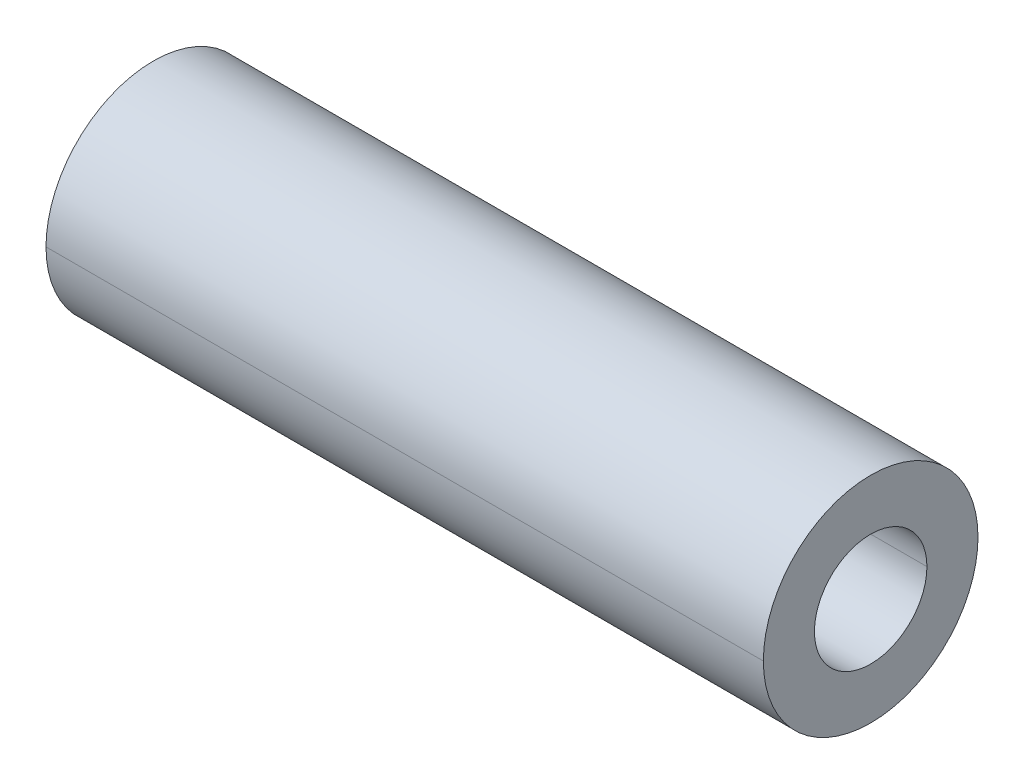
ISO-10303-21;
HEADER;
FILE_DESCRIPTION(('STEP AP214'),'2;1');
FILE_NAME('part.step','',(''),(''),'','','');
FILE_SCHEMA(('AUTOMOTIVE_DESIGN { 1 0 10303 214 1 1 1 1 }'));
ENDSEC;
DATA;
#1=APPLICATION_CONTEXT('core data for automotive mechanical design processes');
#2=APPLICATION_PROTOCOL_DEFINITION('international standard','automotive_design',2000,#1);
#3=PRODUCT_CONTEXT('',#1,'mechanical');
#4=PRODUCT('Part','Part','',(#3));
#5=PRODUCT_RELATED_PRODUCT_CATEGORY('part','',(#4));
#6=PRODUCT_DEFINITION_FORMATION('','',#4);
#7=PRODUCT_DEFINITION_CONTEXT('part definition',#1,'design');
#8=PRODUCT_DEFINITION('design','',#6,#7);
#9=PRODUCT_DEFINITION_SHAPE('','',#8);
#10=(LENGTH_UNIT() NAMED_UNIT(*) SI_UNIT(.MILLI.,.METRE.));
#11=(NAMED_UNIT(*) PLANE_ANGLE_UNIT() SI_UNIT($,.RADIAN.));
#12=(NAMED_UNIT(*) SI_UNIT($,.STERADIAN.) SOLID_ANGLE_UNIT());
#13=UNCERTAINTY_MEASURE_WITH_UNIT(LENGTH_MEASURE(1.E-05),#10,'distance_accuracy_value','');
#14=(GEOMETRIC_REPRESENTATION_CONTEXT(3) GLOBAL_UNCERTAINTY_ASSIGNED_CONTEXT((#13)) GLOBAL_UNIT_ASSIGNED_CONTEXT((#10,
#11,#12)) REPRESENTATION_CONTEXT('',''));
#15=CARTESIAN_POINT('',(0.,0.,0.));
#16=DIRECTION('',(0.,0.,1.));
#17=DIRECTION('',(1.,0.,0.));
#18=AXIS2_PLACEMENT_3D('',#15,#16,#17);
#19=CARTESIAN_POINT('',(15.875,0.,0.));
#20=DIRECTION('',(-1.,0.,0.));
#21=DIRECTION('',(0.,0.,1.));
#22=AXIS2_PLACEMENT_3D('',#19,#20,#21);
#23=CYLINDRICAL_SURFACE('',#22,2.4892);
#24=DIRECTION('',(-1.,0.,0.));
#25=VECTOR('',#24,1.);
#26=CARTESIAN_POINT('',(15.875,0.,-2.4892));
#27=LINE('',#26,#25);
#28=CARTESIAN_POINT('',(15.875,0.,-2.4892));
#29=VERTEX_POINT('',#28);
#30=CARTESIAN_POINT('',(-15.875,0.,-2.4892));
#31=VERTEX_POINT('',#30);
#32=EDGE_CURVE('E85',#29,#31,#27,.T.);
#33=ORIENTED_EDGE('',*,*,#32,.F.);
#34=CARTESIAN_POINT('',(15.875,0.,0.));
#35=DIRECTION('',(1.,0.,0.));
#36=DIRECTION('',(0.,0.,-1.));
#37=AXIS2_PLACEMENT_3D('',#34,#35,#36);
#38=CIRCLE('',#37,2.4892);
#39=CARTESIAN_POINT('',(15.875,0.,2.4892));
#40=VERTEX_POINT('',#39);
#41=EDGE_CURVE('E80',#29,#40,#38,.T.);
#42=ORIENTED_EDGE('',*,*,#41,.T.);
#43=DIRECTION('',(-1.,0.,0.));
#44=VECTOR('',#43,1.);
#45=CARTESIAN_POINT('',(15.875,0.,2.4892));
#46=LINE('',#45,#44);
#47=CARTESIAN_POINT('',(-15.875,0.,2.4892));
#48=VERTEX_POINT('',#47);
#49=EDGE_CURVE('E82',#40,#48,#46,.T.);
#50=ORIENTED_EDGE('',*,*,#49,.T.);
#51=CARTESIAN_POINT('',(-15.875,0.,0.));
#52=DIRECTION('',(1.,0.,0.));
#53=DIRECTION('',(0.,0.,-1.));
#54=AXIS2_PLACEMENT_3D('',#51,#52,#53);
#55=CIRCLE('',#54,2.4892);
#56=EDGE_CURVE('E11',#31,#48,#55,.T.);
#57=ORIENTED_EDGE('',*,*,#56,.F.);
#58=EDGE_LOOP('',(#33,#42,#50,#57));
#59=FACE_BOUND('',#58,.T.);
#60=ADVANCED_FACE('F16',(#59),#23,.F.);
#61=CARTESIAN_POINT('',(15.875,0.,0.));
#62=DIRECTION('',(-1.,0.,0.));
#63=DIRECTION('',(0.,0.,1.));
#64=AXIS2_PLACEMENT_3D('',#61,#62,#63);
#65=CYLINDRICAL_SURFACE('',#64,4.7498);
#66=DIRECTION('',(-1.,0.,0.));
#67=VECTOR('',#66,1.);
#68=CARTESIAN_POINT('',(15.875,0.,-4.7498));
#69=LINE('',#68,#67);
#70=CARTESIAN_POINT('',(15.875,0.,-4.7498));
#71=VERTEX_POINT('',#70);
#72=CARTESIAN_POINT('',(-15.875,0.,-4.7498));
#73=VERTEX_POINT('',#72);
#74=EDGE_CURVE('E112',#71,#73,#69,.T.);
#75=ORIENTED_EDGE('',*,*,#74,.F.);
#76=CARTESIAN_POINT('',(15.875,0.,0.));
#77=DIRECTION('',(1.,0.,0.));
#78=DIRECTION('',(0.,0.,-1.));
#79=AXIS2_PLACEMENT_3D('',#76,#77,#78);
#80=CIRCLE('',#79,4.7498);
#81=CARTESIAN_POINT('',(15.875,0.,4.7498));
#82=VERTEX_POINT('',#81);
#83=EDGE_CURVE('E53',#82,#71,#80,.T.);
#84=ORIENTED_EDGE('',*,*,#83,.F.);
#85=DIRECTION('',(-1.,0.,0.));
#86=VECTOR('',#85,1.);
#87=CARTESIAN_POINT('',(15.875,0.,4.7498));
#88=LINE('',#87,#86);
#89=CARTESIAN_POINT('',(-15.875,0.,4.7498));
#90=VERTEX_POINT('',#89);
#91=EDGE_CURVE('E109',#82,#90,#88,.T.);
#92=ORIENTED_EDGE('',*,*,#91,.T.);
#93=CARTESIAN_POINT('',(-15.875,0.,0.));
#94=DIRECTION('',(1.,0.,0.));
#95=DIRECTION('',(0.,0.,-1.));
#96=AXIS2_PLACEMENT_3D('',#93,#94,#95);
#97=CIRCLE('',#96,4.7498);
#98=EDGE_CURVE('E27',#90,#73,#97,.T.);
#99=ORIENTED_EDGE('',*,*,#98,.T.);
#100=EDGE_LOOP('',(#75,#84,#92,#99));
#101=FACE_BOUND('',#100,.T.);
#102=ADVANCED_FACE('F18',(#101),#65,.T.);
#103=CARTESIAN_POINT('',(-15.875,0.,0.));
#104=DIRECTION('',(1.,0.,0.));
#105=DIRECTION('',(0.,1.,0.));
#106=AXIS2_PLACEMENT_3D('',#103,#104,#105);
#107=PLANE('',#106);
#108=CARTESIAN_POINT('',(-15.875,0.,0.));
#109=DIRECTION('',(1.,0.,0.));
#110=DIRECTION('',(0.,0.,-1.));
#111=AXIS2_PLACEMENT_3D('',#108,#109,#110);
#112=CIRCLE('',#111,2.4892);
#113=EDGE_CURVE('E94',#48,#31,#112,.T.);
#114=ORIENTED_EDGE('',*,*,#113,.T.);
#115=ORIENTED_EDGE('',*,*,#56,.T.);
#116=EDGE_LOOP('',(#114,#115));
#117=FACE_BOUND('',#116,.T.);
#118=ORIENTED_EDGE('',*,*,#98,.F.);
#119=CARTESIAN_POINT('',(-15.875,0.,0.));
#120=DIRECTION('',(1.,0.,0.));
#121=DIRECTION('',(0.,0.,-1.));
#122=AXIS2_PLACEMENT_3D('',#119,#120,#121);
#123=CIRCLE('',#122,4.7498);
#124=EDGE_CURVE('E20',#73,#90,#123,.T.);
#125=ORIENTED_EDGE('',*,*,#124,.F.);
#126=EDGE_LOOP('',(#118,#125));
#127=FACE_BOUND('',#126,.T.);
#128=ADVANCED_FACE('F130',(#117,#127),#107,.F.);
#129=CARTESIAN_POINT('',(15.875,0.,0.));
#130=DIRECTION('',(1.,0.,0.));
#131=DIRECTION('',(0.,1.,0.));
#132=AXIS2_PLACEMENT_3D('',#129,#130,#131);
#133=PLANE('',#132);
#134=CARTESIAN_POINT('',(15.875,0.,0.));
#135=DIRECTION('',(1.,0.,0.));
#136=DIRECTION('',(0.,0.,-1.));
#137=AXIS2_PLACEMENT_3D('',#134,#135,#136);
#138=CIRCLE('',#137,2.4892);
#139=EDGE_CURVE('E93',#40,#29,#138,.T.);
#140=ORIENTED_EDGE('',*,*,#139,.F.);
#141=ORIENTED_EDGE('',*,*,#41,.F.);
#142=EDGE_LOOP('',(#140,#141));
#143=FACE_BOUND('',#142,.T.);
#144=ORIENTED_EDGE('',*,*,#83,.T.);
#145=CARTESIAN_POINT('',(15.875,0.,0.));
#146=DIRECTION('',(1.,0.,0.));
#147=DIRECTION('',(0.,0.,-1.));
#148=AXIS2_PLACEMENT_3D('',#145,#146,#147);
#149=CIRCLE('',#148,4.7498);
#150=EDGE_CURVE('E96',#71,#82,#149,.T.);
#151=ORIENTED_EDGE('',*,*,#150,.T.);
#152=EDGE_LOOP('',(#144,#151));
#153=FACE_BOUND('',#152,.T.);
#154=ADVANCED_FACE('F98',(#143,#153),#133,.T.);
#155=CARTESIAN_POINT('',(15.875,0.,0.));
#156=DIRECTION('',(-1.,0.,0.));
#157=DIRECTION('',(0.,0.,1.));
#158=AXIS2_PLACEMENT_3D('',#155,#156,#157);
#159=CYLINDRICAL_SURFACE('',#158,4.7498);
#160=ORIENTED_EDGE('',*,*,#150,.F.);
#161=ORIENTED_EDGE('',*,*,#74,.T.);
#162=ORIENTED_EDGE('',*,*,#124,.T.);
#163=ORIENTED_EDGE('',*,*,#91,.F.);
#164=EDGE_LOOP('',(#160,#161,#162,#163));
#165=FACE_BOUND('',#164,.T.);
#166=ADVANCED_FACE('F129',(#165),#159,.T.);
#167=CARTESIAN_POINT('',(15.875,0.,0.));
#168=DIRECTION('',(-1.,0.,0.));
#169=DIRECTION('',(0.,0.,1.));
#170=AXIS2_PLACEMENT_3D('',#167,#168,#169);
#171=CYLINDRICAL_SURFACE('',#170,2.4892);
#172=ORIENTED_EDGE('',*,*,#139,.T.);
#173=ORIENTED_EDGE('',*,*,#32,.T.);
#174=ORIENTED_EDGE('',*,*,#113,.F.);
#175=ORIENTED_EDGE('',*,*,#49,.F.);
#176=EDGE_LOOP('',(#172,#173,#174,#175));
#177=FACE_BOUND('',#176,.T.);
#178=ADVANCED_FACE('F92',(#177),#171,.F.);
#179=CLOSED_SHELL('',(#60,#102,#128,#154,#166,#178));
#180=MANIFOLD_SOLID_BREP('B1',#179);
#181=ADVANCED_BREP_SHAPE_REPRESENTATION('',(#18,#180),#14);
#182=SHAPE_DEFINITION_REPRESENTATION(#9,#181);
ENDSEC;
END-ISO-10303-21;
